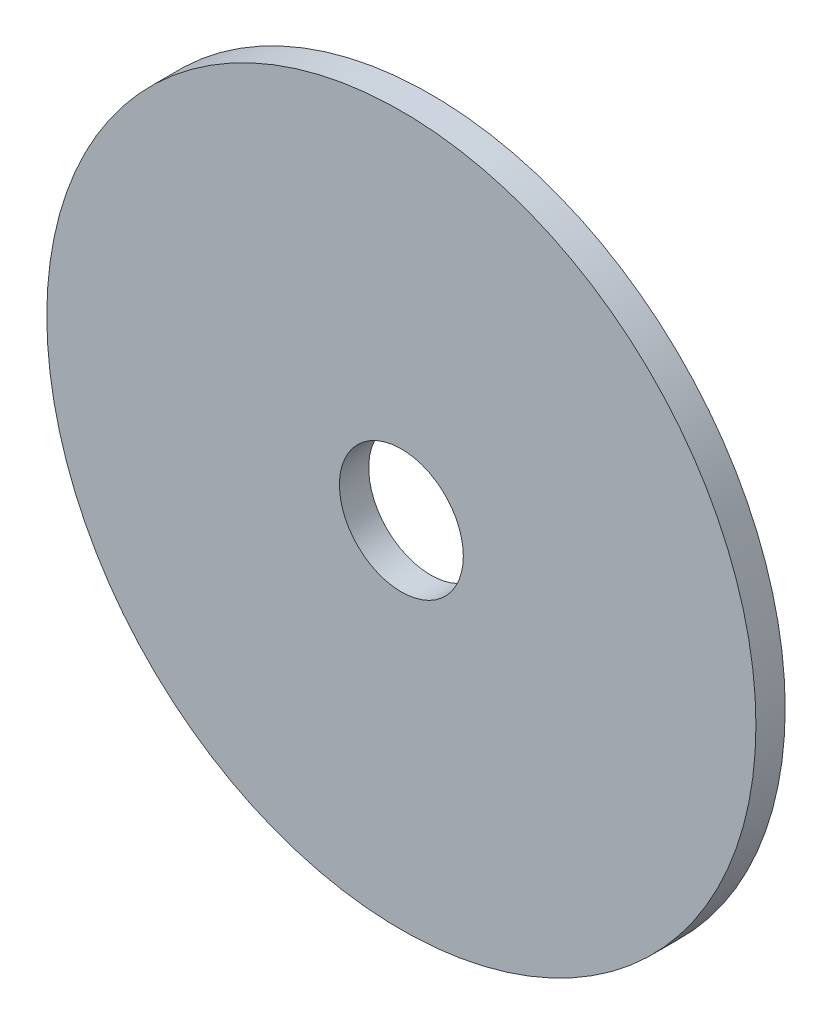
ISO-10303-21;
HEADER;
FILE_DESCRIPTION(('STEP AP214'),'2;1');
FILE_NAME('part.step','',(''),(''),'','','');
FILE_SCHEMA(('AUTOMOTIVE_DESIGN { 1 0 10303 214 1 1 1 1 }'));
ENDSEC;
DATA;
#1=APPLICATION_CONTEXT('core data for automotive mechanical design processes');
#2=APPLICATION_PROTOCOL_DEFINITION('international standard','automotive_design',2000,#1);
#3=PRODUCT_CONTEXT('',#1,'mechanical');
#4=PRODUCT('Part','Part','',(#3));
#5=PRODUCT_RELATED_PRODUCT_CATEGORY('part','',(#4));
#6=PRODUCT_DEFINITION_FORMATION('','',#4);
#7=PRODUCT_DEFINITION_CONTEXT('part definition',#1,'design');
#8=PRODUCT_DEFINITION('design','',#6,#7);
#9=PRODUCT_DEFINITION_SHAPE('','',#8);
#10=(LENGTH_UNIT() NAMED_UNIT(*) SI_UNIT(.MILLI.,.METRE.));
#11=(NAMED_UNIT(*) PLANE_ANGLE_UNIT() SI_UNIT($,.RADIAN.));
#12=(NAMED_UNIT(*) SI_UNIT($,.STERADIAN.) SOLID_ANGLE_UNIT());
#13=UNCERTAINTY_MEASURE_WITH_UNIT(LENGTH_MEASURE(1.E-05),#10,'distance_accuracy_value','');
#14=(GEOMETRIC_REPRESENTATION_CONTEXT(3) GLOBAL_UNCERTAINTY_ASSIGNED_CONTEXT((#13)) GLOBAL_UNIT_ASSIGNED_CONTEXT((#10,
#11,#12)) REPRESENTATION_CONTEXT('',''));
#15=CARTESIAN_POINT('',(0.,0.,0.));
#16=DIRECTION('',(0.,0.,1.));
#17=DIRECTION('',(1.,0.,0.));
#18=AXIS2_PLACEMENT_3D('',#15,#16,#17);
#19=CARTESIAN_POINT('',(-5.06519506104383,3.50945657800895,1.5));
#20=DIRECTION('',(0.,0.,1.));
#21=DIRECTION('',(1.,0.,0.));
#22=AXIS2_PLACEMENT_3D('',#19,#20,#21);
#23=PLANE('',#22);
#24=CARTESIAN_POINT('',(-5.06519506104383,3.50945657800895,1.5));
#25=DIRECTION('',(0.,0.,1.));
#26=DIRECTION('',(1.,0.,0.));
#27=AXIS2_PLACEMENT_3D('',#24,#25,#26);
#28=CIRCLE('',#27,18.175);
#29=CARTESIAN_POINT('',(13.1098049389562,3.50945657800895,1.5));
#30=VERTEX_POINT('',#29);
#31=EDGE_CURVE('E10',#30,#30,#28,.T.);
#32=ORIENTED_EDGE('',*,*,#31,.T.);
#33=EDGE_LOOP('',(#32));
#34=FACE_BOUND('',#33,.T.);
#35=CARTESIAN_POINT('',(-5.06519506104383,3.50945657800895,1.5));
#36=DIRECTION('',(0.,0.,1.));
#37=DIRECTION('',(1.,0.,0.));
#38=AXIS2_PLACEMENT_3D('',#35,#36,#37);
#39=CIRCLE('',#38,3.175);
#40=CARTESIAN_POINT('',(-1.89019506104383,3.50945657800895,1.5));
#41=VERTEX_POINT('',#40);
#42=EDGE_CURVE('E50',#41,#41,#39,.T.);
#43=ORIENTED_EDGE('',*,*,#42,.F.);
#44=EDGE_LOOP('',(#43));
#45=FACE_BOUND('',#44,.T.);
#46=ADVANCED_FACE('F37',(#34,#45),#23,.T.);
#47=CARTESIAN_POINT('',(-5.06519506104383,3.50945657800895,0.));
#48=DIRECTION('',(0.,0.,1.));
#49=DIRECTION('',(1.,0.,0.));
#50=AXIS2_PLACEMENT_3D('',#47,#48,#49);
#51=PLANE('',#50);
#52=CARTESIAN_POINT('',(-5.06519506104383,3.50945657800895,0.));
#53=DIRECTION('',(0.,0.,1.));
#54=DIRECTION('',(1.,0.,0.));
#55=AXIS2_PLACEMENT_3D('',#52,#53,#54);
#56=CIRCLE('',#55,18.175);
#57=CARTESIAN_POINT('',(13.1098049389562,3.50945657800895,0.));
#58=VERTEX_POINT('',#57);
#59=EDGE_CURVE('E41',#58,#58,#56,.T.);
#60=ORIENTED_EDGE('',*,*,#59,.F.);
#61=EDGE_LOOP('',(#60));
#62=FACE_BOUND('',#61,.T.);
#63=CARTESIAN_POINT('',(-5.06519506104383,3.50945657800895,0.));
#64=DIRECTION('',(0.,0.,1.));
#65=DIRECTION('',(1.,0.,0.));
#66=AXIS2_PLACEMENT_3D('',#63,#64,#65);
#67=CIRCLE('',#66,3.175);
#68=CARTESIAN_POINT('',(-1.89019506104383,3.50945657800895,0.));
#69=VERTEX_POINT('',#68);
#70=EDGE_CURVE('E52',#69,#69,#67,.T.);
#71=ORIENTED_EDGE('',*,*,#70,.T.);
#72=EDGE_LOOP('',(#71));
#73=FACE_BOUND('',#72,.T.);
#74=ADVANCED_FACE('F64',(#62,#73),#51,.F.);
#75=CARTESIAN_POINT('',(-5.06519506104383,3.50945657800895,1.5));
#76=DIRECTION('',(0.,0.,-1.));
#77=DIRECTION('',(-1.,0.,0.));
#78=AXIS2_PLACEMENT_3D('',#75,#76,#77);
#79=CYLINDRICAL_SURFACE('',#78,18.175);
#80=ORIENTED_EDGE('',*,*,#31,.F.);
#81=EDGE_LOOP('',(#80));
#82=FACE_BOUND('',#81,.T.);
#83=ORIENTED_EDGE('',*,*,#59,.T.);
#84=EDGE_LOOP('',(#83));
#85=FACE_BOUND('',#84,.T.);
#86=ADVANCED_FACE('F39',(#82,#85),#79,.T.);
#87=CARTESIAN_POINT('',(-5.06519506104383,3.50945657800895,1.5));
#88=DIRECTION('',(0.,0.,-1.));
#89=DIRECTION('',(-1.,0.,0.));
#90=AXIS2_PLACEMENT_3D('',#87,#88,#89);
#91=CYLINDRICAL_SURFACE('',#90,3.175);
#92=ORIENTED_EDGE('',*,*,#42,.T.);
#93=EDGE_LOOP('',(#92));
#94=FACE_BOUND('',#93,.T.);
#95=ORIENTED_EDGE('',*,*,#70,.F.);
#96=EDGE_LOOP('',(#95));
#97=FACE_BOUND('',#96,.T.);
#98=ADVANCED_FACE('F60',(#94,#97),#91,.F.);
#99=CLOSED_SHELL('',(#46,#74,#86,#98));
#100=MANIFOLD_SOLID_BREP('B2',#99);
#101=ADVANCED_BREP_SHAPE_REPRESENTATION('',(#18,#100),#14);
#102=SHAPE_DEFINITION_REPRESENTATION(#9,#101);
ENDSEC;
END-ISO-10303-21;
